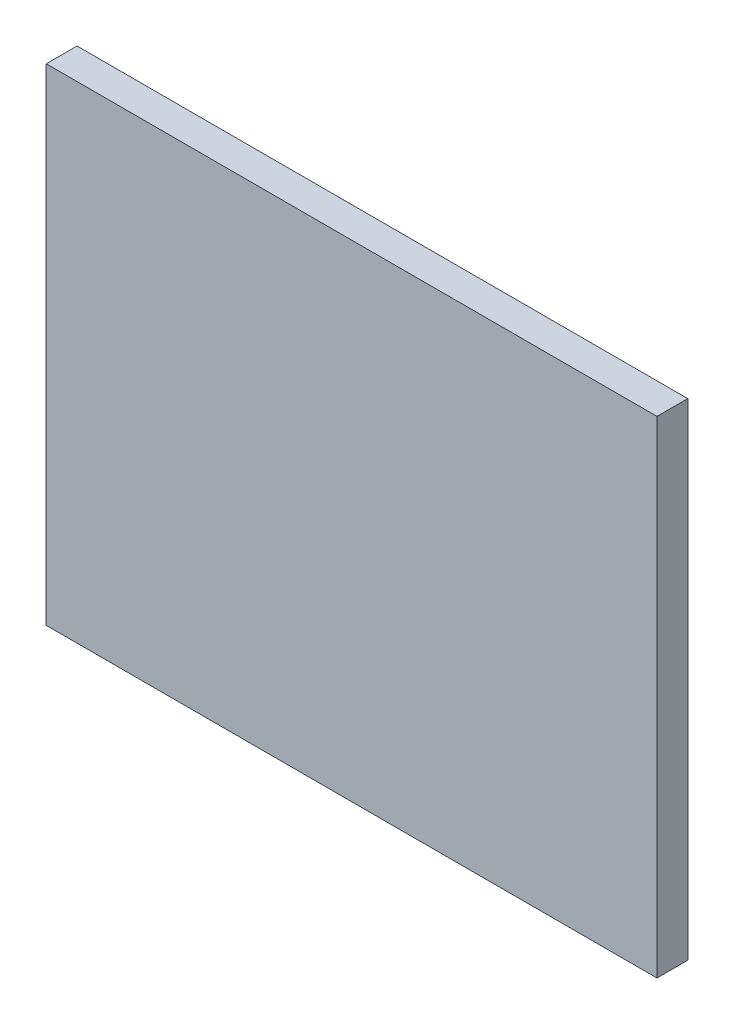
ISO-10303-21;
HEADER;
FILE_DESCRIPTION(('STEP AP214'),'2;1');
FILE_NAME('part.step','',(''),(''),'','','');
FILE_SCHEMA(('AUTOMOTIVE_DESIGN { 1 0 10303 214 1 1 1 1 }'));
ENDSEC;
DATA;
#1=APPLICATION_CONTEXT('core data for automotive mechanical design processes');
#2=APPLICATION_PROTOCOL_DEFINITION('international standard','automotive_design',2000,#1);
#3=PRODUCT_CONTEXT('',#1,'mechanical');
#4=PRODUCT('Part','Part','',(#3));
#5=PRODUCT_RELATED_PRODUCT_CATEGORY('part','',(#4));
#6=PRODUCT_DEFINITION_FORMATION('','',#4);
#7=PRODUCT_DEFINITION_CONTEXT('part definition',#1,'design');
#8=PRODUCT_DEFINITION('design','',#6,#7);
#9=PRODUCT_DEFINITION_SHAPE('','',#8);
#10=(LENGTH_UNIT() NAMED_UNIT(*) SI_UNIT(.MILLI.,.METRE.));
#11=(NAMED_UNIT(*) PLANE_ANGLE_UNIT() SI_UNIT($,.RADIAN.));
#12=(NAMED_UNIT(*) SI_UNIT($,.STERADIAN.) SOLID_ANGLE_UNIT());
#13=UNCERTAINTY_MEASURE_WITH_UNIT(LENGTH_MEASURE(1.E-05),#10,'distance_accuracy_value','');
#14=(GEOMETRIC_REPRESENTATION_CONTEXT(3) GLOBAL_UNCERTAINTY_ASSIGNED_CONTEXT((#13)) GLOBAL_UNIT_ASSIGNED_CONTEXT((#10,
#11,#12)) REPRESENTATION_CONTEXT('',''));
#15=CARTESIAN_POINT('',(0.,0.,0.));
#16=DIRECTION('',(0.,0.,1.));
#17=DIRECTION('',(1.,0.,0.));
#18=AXIS2_PLACEMENT_3D('',#15,#16,#17);
#19=CARTESIAN_POINT('',(-60.,39.5,5.));
#20=DIRECTION('',(0.,-1.,0.));
#21=DIRECTION('',(0.,0.,-1.));
#22=AXIS2_PLACEMENT_3D('',#19,#20,#21);
#23=PLANE('',#22);
#24=DIRECTION('',(-1.,0.,0.));
#25=VECTOR('',#24,1.);
#26=CARTESIAN_POINT('',(-60.,39.5,5.));
#27=LINE('',#26,#25);
#28=CARTESIAN_POINT('',(39.1977911354533,39.5,5.));
#29=VERTEX_POINT('',#28);
#30=CARTESIAN_POINT('',(-60.,39.5,5.));
#31=VERTEX_POINT('',#30);
#32=EDGE_CURVE('E87',#29,#31,#27,.T.);
#33=ORIENTED_EDGE('',*,*,#32,.F.);
#34=DIRECTION('',(0.,0.,-1.));
#35=VECTOR('',#34,1.);
#36=CARTESIAN_POINT('',(39.1977911354533,39.5,8.));
#37=LINE('',#36,#35);
#38=CARTESIAN_POINT('',(39.1977911354533,39.5,0.));
#39=VERTEX_POINT('',#38);
#40=EDGE_CURVE('E97',#29,#39,#37,.T.);
#41=ORIENTED_EDGE('',*,*,#40,.T.);
#42=DIRECTION('',(-1.,0.,0.));
#43=VECTOR('',#42,1.);
#44=CARTESIAN_POINT('',(-60.,39.5,0.));
#45=LINE('',#44,#43);
#46=CARTESIAN_POINT('',(-60.,39.5,0.));
#47=VERTEX_POINT('',#46);
#48=EDGE_CURVE('E79',#39,#47,#45,.T.);
#49=ORIENTED_EDGE('',*,*,#48,.T.);
#50=DIRECTION('',(0.,0.,-1.));
#51=VECTOR('',#50,1.);
#52=CARTESIAN_POINT('',(-60.,39.5,5.));
#53=LINE('',#52,#51);
#54=EDGE_CURVE('E11',#31,#47,#53,.T.);
#55=ORIENTED_EDGE('',*,*,#54,.F.);
#56=EDGE_LOOP('',(#33,#41,#49,#55));
#57=FACE_BOUND('',#56,.T.);
#58=ADVANCED_FACE('F35',(#57),#23,.F.);
#59=CARTESIAN_POINT('',(-60.,-39.5,5.));
#60=DIRECTION('',(1.,0.,0.));
#61=DIRECTION('',(0.,0.,-1.));
#62=AXIS2_PLACEMENT_3D('',#59,#60,#61);
#63=PLANE('',#62);
#64=DIRECTION('',(0.,-1.,0.));
#65=VECTOR('',#64,1.);
#66=CARTESIAN_POINT('',(-60.,-39.5,0.));
#67=LINE('',#66,#65);
#68=CARTESIAN_POINT('',(-60.,-39.5,0.));
#69=VERTEX_POINT('',#68);
#70=EDGE_CURVE('E70',#47,#69,#67,.T.);
#71=ORIENTED_EDGE('',*,*,#70,.T.);
#72=DIRECTION('',(0.,0.,-1.));
#73=VECTOR('',#72,1.);
#74=CARTESIAN_POINT('',(-60.,-39.5,5.));
#75=LINE('',#74,#73);
#76=CARTESIAN_POINT('',(-60.,-39.5,5.));
#77=VERTEX_POINT('',#76);
#78=EDGE_CURVE('E42',#77,#69,#75,.T.);
#79=ORIENTED_EDGE('',*,*,#78,.F.);
#80=DIRECTION('',(0.,-1.,0.));
#81=VECTOR('',#80,1.);
#82=CARTESIAN_POINT('',(-60.,-39.5,5.));
#83=LINE('',#82,#81);
#84=EDGE_CURVE('E58',#31,#77,#83,.T.);
#85=ORIENTED_EDGE('',*,*,#84,.F.);
#86=ORIENTED_EDGE('',*,*,#54,.T.);
#87=EDGE_LOOP('',(#71,#79,#85,#86));
#88=FACE_BOUND('',#87,.T.);
#89=ADVANCED_FACE('F72',(#88),#63,.F.);
#90=CARTESIAN_POINT('',(-60.,-39.5,5.));
#91=DIRECTION('',(0.,1.,0.));
#92=DIRECTION('',(0.,0.,1.));
#93=AXIS2_PLACEMENT_3D('',#90,#91,#92);
#94=PLANE('',#93);
#95=DIRECTION('',(1.,0.,0.));
#96=VECTOR('',#95,1.);
#97=CARTESIAN_POINT('',(-60.,-39.5,0.));
#98=LINE('',#97,#96);
#99=CARTESIAN_POINT('',(39.1977911354533,-39.5,0.));
#100=VERTEX_POINT('',#99);
#101=EDGE_CURVE('E78',#69,#100,#98,.T.);
#102=ORIENTED_EDGE('',*,*,#101,.T.);
#103=DIRECTION('',(0.,0.,-1.));
#104=VECTOR('',#103,1.);
#105=CARTESIAN_POINT('',(39.1977911354533,-39.5,8.));
#106=LINE('',#105,#104);
#107=CARTESIAN_POINT('',(39.1977911354533,-39.5,5.));
#108=VERTEX_POINT('',#107);
#109=EDGE_CURVE('E49',#108,#100,#106,.T.);
#110=ORIENTED_EDGE('',*,*,#109,.F.);
#111=DIRECTION('',(1.,0.,0.));
#112=VECTOR('',#111,1.);
#113=CARTESIAN_POINT('',(-60.,-39.5,5.));
#114=LINE('',#113,#112);
#115=EDGE_CURVE('E84',#77,#108,#114,.T.);
#116=ORIENTED_EDGE('',*,*,#115,.F.);
#117=ORIENTED_EDGE('',*,*,#78,.T.);
#118=EDGE_LOOP('',(#102,#110,#116,#117));
#119=FACE_BOUND('',#118,.T.);
#120=ADVANCED_FACE('F83',(#119),#94,.F.);
#121=CARTESIAN_POINT('',(0.,0.,5.));
#122=DIRECTION('',(0.,0.,-1.));
#123=DIRECTION('',(-1.,0.,0.));
#124=AXIS2_PLACEMENT_3D('',#121,#122,#123);
#125=PLANE('',#124);
#126=ORIENTED_EDGE('',*,*,#115,.T.);
#127=DIRECTION('',(0.,1.,0.));
#128=VECTOR('',#127,1.);
#129=CARTESIAN_POINT('',(39.1977911354533,0.,5.));
#130=LINE('',#129,#128);
#131=EDGE_CURVE('E92',#108,#29,#130,.T.);
#132=ORIENTED_EDGE('',*,*,#131,.T.);
#133=ORIENTED_EDGE('',*,*,#32,.T.);
#134=ORIENTED_EDGE('',*,*,#84,.T.);
#135=EDGE_LOOP('',(#126,#132,#133,#134));
#136=FACE_BOUND('',#135,.T.);
#137=ADVANCED_FACE('F108',(#136),#125,.F.);
#138=CARTESIAN_POINT('',(0.,0.,0.));
#139=DIRECTION('',(0.,0.,-1.));
#140=DIRECTION('',(-1.,0.,0.));
#141=AXIS2_PLACEMENT_3D('',#138,#139,#140);
#142=PLANE('',#141);
#143=DIRECTION('',(0.,1.,0.));
#144=VECTOR('',#143,1.);
#145=CARTESIAN_POINT('',(39.1977911354533,-39.5,0.));
#146=LINE('',#145,#144);
#147=EDGE_CURVE('E86',#100,#39,#146,.T.);
#148=ORIENTED_EDGE('',*,*,#147,.F.);
#149=ORIENTED_EDGE('',*,*,#101,.F.);
#150=ORIENTED_EDGE('',*,*,#70,.F.);
#151=ORIENTED_EDGE('',*,*,#48,.F.);
#152=EDGE_LOOP('',(#148,#149,#150,#151));
#153=FACE_BOUND('',#152,.T.);
#154=ADVANCED_FACE('F85',(#153),#142,.T.);
#155=CARTESIAN_POINT('',(39.1977911354533,-39.5,8.));
#156=DIRECTION('',(-1.,0.,0.));
#157=DIRECTION('',(0.,0.,1.));
#158=AXIS2_PLACEMENT_3D('',#155,#156,#157);
#159=PLANE('',#158);
#160=ORIENTED_EDGE('',*,*,#109,.T.);
#161=ORIENTED_EDGE('',*,*,#147,.T.);
#162=ORIENTED_EDGE('',*,*,#40,.F.);
#163=ORIENTED_EDGE('',*,*,#131,.F.);
#164=EDGE_LOOP('',(#160,#161,#162,#163));
#165=FACE_BOUND('',#164,.T.);
#166=ADVANCED_FACE('F103',(#165),#159,.F.);
#167=CLOSED_SHELL('',(#58,#89,#120,#137,#154,#166));
#168=MANIFOLD_SOLID_BREP('B2',#167);
#169=ADVANCED_BREP_SHAPE_REPRESENTATION('',(#18,#168),#14);
#170=SHAPE_DEFINITION_REPRESENTATION(#9,#169);
ENDSEC;
END-ISO-10303-21;
